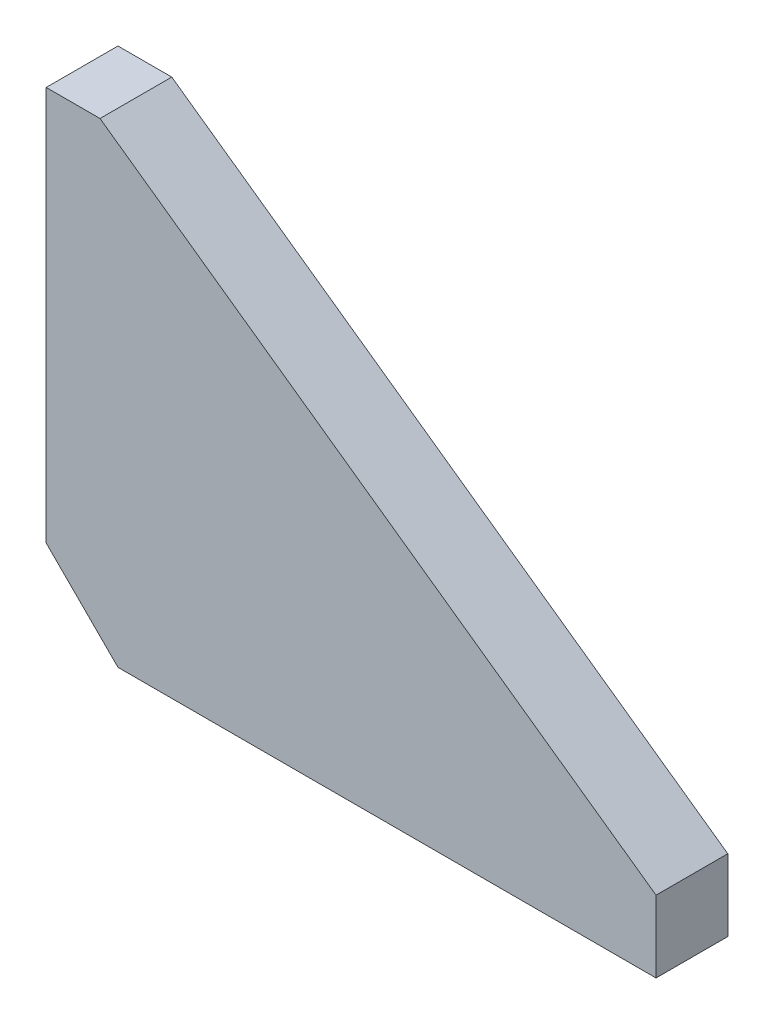
ISO-10303-21;
HEADER;
FILE_DESCRIPTION(('STEP AP214'),'2;1');
FILE_NAME('part.step','',(''),(''),'','','');
FILE_SCHEMA(('AUTOMOTIVE_DESIGN { 1 0 10303 214 1 1 1 1 }'));
ENDSEC;
DATA;
#1=APPLICATION_CONTEXT('core data for automotive mechanical design processes');
#2=APPLICATION_PROTOCOL_DEFINITION('international standard','automotive_design',2000,#1);
#3=PRODUCT_CONTEXT('',#1,'mechanical');
#4=PRODUCT('Part','Part','',(#3));
#5=PRODUCT_RELATED_PRODUCT_CATEGORY('part','',(#4));
#6=PRODUCT_DEFINITION_FORMATION('','',#4);
#7=PRODUCT_DEFINITION_CONTEXT('part definition',#1,'design');
#8=PRODUCT_DEFINITION('design','',#6,#7);
#9=PRODUCT_DEFINITION_SHAPE('','',#8);
#10=(LENGTH_UNIT() NAMED_UNIT(*) SI_UNIT(.MILLI.,.METRE.));
#11=(NAMED_UNIT(*) PLANE_ANGLE_UNIT() SI_UNIT($,.RADIAN.));
#12=(NAMED_UNIT(*) SI_UNIT($,.STERADIAN.) SOLID_ANGLE_UNIT());
#13=UNCERTAINTY_MEASURE_WITH_UNIT(LENGTH_MEASURE(1.E-05),#10,'distance_accuracy_value','');
#14=(GEOMETRIC_REPRESENTATION_CONTEXT(3) GLOBAL_UNCERTAINTY_ASSIGNED_CONTEXT((#13)) GLOBAL_UNIT_ASSIGNED_CONTEXT((#10,
#11,#12)) REPRESENTATION_CONTEXT('',''));
#15=CARTESIAN_POINT('',(0.,0.,0.));
#16=DIRECTION('',(0.,0.,1.));
#17=DIRECTION('',(1.,0.,0.));
#18=AXIS2_PLACEMENT_3D('',#15,#16,#17);
#19=CARTESIAN_POINT('',(70.,0.,4.));
#20=DIRECTION('',(0.,1.,0.));
#21=DIRECTION('',(-1.,0.,0.));
#22=AXIS2_PLACEMENT_3D('',#19,#20,#21);
#23=PLANE('',#22);
#24=DIRECTION('',(1.,0.,0.));
#25=VECTOR('',#24,1.);
#26=CARTESIAN_POINT('',(70.,0.,4.));
#27=LINE('',#26,#25);
#28=CARTESIAN_POINT('',(10.,0.,4.));
#29=VERTEX_POINT('',#28);
#30=CARTESIAN_POINT('',(70.,0.,4.));
#31=VERTEX_POINT('',#30);
#32=EDGE_CURVE('E118',#29,#31,#27,.T.);
#33=ORIENTED_EDGE('',*,*,#32,.F.);
#34=DIRECTION('',(0.,0.,-1.));
#35=VECTOR('',#34,1.);
#36=CARTESIAN_POINT('',(10.,0.,4.));
#37=LINE('',#36,#35);
#38=CARTESIAN_POINT('',(10.,0.,-4.));
#39=VERTEX_POINT('',#38);
#40=EDGE_CURVE('E148',#29,#39,#37,.T.);
#41=ORIENTED_EDGE('',*,*,#40,.T.);
#42=DIRECTION('',(1.,0.,0.));
#43=VECTOR('',#42,1.);
#44=CARTESIAN_POINT('',(70.,0.,-4.));
#45=LINE('',#44,#43);
#46=CARTESIAN_POINT('',(70.,0.,-4.));
#47=VERTEX_POINT('',#46);
#48=EDGE_CURVE('E145',#39,#47,#45,.T.);
#49=ORIENTED_EDGE('',*,*,#48,.T.);
#50=DIRECTION('',(0.,0.,-1.));
#51=VECTOR('',#50,1.);
#52=CARTESIAN_POINT('',(70.,0.,4.));
#53=LINE('',#52,#51);
#54=EDGE_CURVE('E137',#31,#47,#53,.T.);
#55=ORIENTED_EDGE('',*,*,#54,.F.);
#56=EDGE_LOOP('',(#33,#41,#49,#55));
#57=FACE_BOUND('',#56,.T.);
#58=ADVANCED_FACE('F51',(#57),#23,.F.);
#59=CARTESIAN_POINT('',(70.,0.,4.));
#60=DIRECTION('',(-1.,0.,0.));
#61=DIRECTION('',(0.,0.,1.));
#62=AXIS2_PLACEMENT_3D('',#59,#60,#61);
#63=PLANE('',#62);
#64=DIRECTION('',(0.,1.,0.));
#65=VECTOR('',#64,1.);
#66=CARTESIAN_POINT('',(70.,0.,-4.));
#67=LINE('',#66,#65);
#68=CARTESIAN_POINT('',(70.,8.,-4.));
#69=VERTEX_POINT('',#68);
#70=EDGE_CURVE('E217',#47,#69,#67,.T.);
#71=ORIENTED_EDGE('',*,*,#70,.T.);
#72=DIRECTION('',(0.,0.,-1.));
#73=VECTOR('',#72,1.);
#74=CARTESIAN_POINT('',(70.,8.,4.));
#75=LINE('',#74,#73);
#76=CARTESIAN_POINT('',(70.,8.,4.));
#77=VERTEX_POINT('',#76);
#78=EDGE_CURVE('E139',#77,#69,#75,.T.);
#79=ORIENTED_EDGE('',*,*,#78,.F.);
#80=DIRECTION('',(0.,1.,0.));
#81=VECTOR('',#80,1.);
#82=CARTESIAN_POINT('',(70.,0.,4.));
#83=LINE('',#82,#81);
#84=EDGE_CURVE('E122',#31,#77,#83,.T.);
#85=ORIENTED_EDGE('',*,*,#84,.F.);
#86=ORIENTED_EDGE('',*,*,#54,.T.);
#87=EDGE_LOOP('',(#71,#79,#85,#86));
#88=FACE_BOUND('',#87,.T.);
#89=ADVANCED_FACE('F136',(#88),#63,.F.);
#90=CARTESIAN_POINT('',(8.,52.,4.));
#91=DIRECTION('',(-0.578747005941122,-0.815507144735217,0.));
#92=DIRECTION('',(0.815507144735217,-0.578747005941122,0.));
#93=AXIS2_PLACEMENT_3D('',#90,#91,#92);
#94=PLANE('',#93);
#95=DIRECTION('',(-0.815507144735217,0.578747005941122,0.));
#96=VECTOR('',#95,1.);
#97=CARTESIAN_POINT('',(8.,52.,-4.));
#98=LINE('',#97,#96);
#99=CARTESIAN_POINT('',(8.,52.,-4.));
#100=VERTEX_POINT('',#99);
#101=EDGE_CURVE('E222',#69,#100,#98,.T.);
#102=ORIENTED_EDGE('',*,*,#101,.T.);
#103=DIRECTION('',(0.,0.,-1.));
#104=VECTOR('',#103,1.);
#105=CARTESIAN_POINT('',(8.,52.,4.));
#106=LINE('',#105,#104);
#107=CARTESIAN_POINT('',(8.,52.,4.));
#108=VERTEX_POINT('',#107);
#109=EDGE_CURVE('E155',#108,#100,#106,.T.);
#110=ORIENTED_EDGE('',*,*,#109,.F.);
#111=DIRECTION('',(-0.815507144735217,0.578747005941122,0.));
#112=VECTOR('',#111,1.);
#113=CARTESIAN_POINT('',(8.,52.,4.));
#114=LINE('',#113,#112);
#115=EDGE_CURVE('E142',#77,#108,#114,.T.);
#116=ORIENTED_EDGE('',*,*,#115,.F.);
#117=ORIENTED_EDGE('',*,*,#78,.T.);
#118=EDGE_LOOP('',(#102,#110,#116,#117));
#119=FACE_BOUND('',#118,.T.);
#120=ADVANCED_FACE('F232',(#119),#94,.F.);
#121=CARTESIAN_POINT('',(8.,52.,4.));
#122=DIRECTION('',(0.,-1.,0.));
#123=DIRECTION('',(0.,0.,-1.));
#124=AXIS2_PLACEMENT_3D('',#121,#122,#123);
#125=PLANE('',#124);
#126=DIRECTION('',(-1.,0.,0.));
#127=VECTOR('',#126,1.);
#128=CARTESIAN_POINT('',(8.,52.,-4.));
#129=LINE('',#128,#127);
#130=CARTESIAN_POINT('',(2.00000000000001,52.,-4.));
#131=VERTEX_POINT('',#130);
#132=EDGE_CURVE('E132',#100,#131,#129,.T.);
#133=ORIENTED_EDGE('',*,*,#132,.T.);
#134=DIRECTION('',(0.,0.,1.));
#135=VECTOR('',#134,1.);
#136=CARTESIAN_POINT('',(2.00000000000001,52.,4.));
#137=LINE('',#136,#135);
#138=CARTESIAN_POINT('',(2.,52.,4.));
#139=VERTEX_POINT('',#138);
#140=EDGE_CURVE('E61',#131,#139,#137,.T.);
#141=ORIENTED_EDGE('',*,*,#140,.T.);
#142=DIRECTION('',(-1.,0.,0.));
#143=VECTOR('',#142,1.);
#144=CARTESIAN_POINT('',(8.,52.,4.));
#145=LINE('',#144,#143);
#146=EDGE_CURVE('E198',#108,#139,#145,.T.);
#147=ORIENTED_EDGE('',*,*,#146,.F.);
#148=ORIENTED_EDGE('',*,*,#109,.T.);
#149=EDGE_LOOP('',(#133,#141,#147,#148));
#150=FACE_BOUND('',#149,.T.);
#151=ADVANCED_FACE('F196',(#150),#125,.F.);
#152=CARTESIAN_POINT('',(0.,0.,4.));
#153=DIRECTION('',(1.,0.,0.));
#154=DIRECTION('',(0.,0.,-1.));
#155=AXIS2_PLACEMENT_3D('',#152,#153,#154);
#156=PLANE('',#155);
#157=DIRECTION('',(0.,1.,0.));
#158=VECTOR('',#157,1.);
#159=CARTESIAN_POINT('',(0.,0.,1.99999999999999));
#160=LINE('',#159,#158);
#161=CARTESIAN_POINT('',(0.,10.,1.99999999999999));
#162=VERTEX_POINT('',#161);
#163=CARTESIAN_POINT('',(0.,50.,1.99999999999999));
#164=VERTEX_POINT('',#163);
#165=EDGE_CURVE('E168',#162,#164,#160,.T.);
#166=ORIENTED_EDGE('',*,*,#165,.T.);
#167=DIRECTION('',(0.,0.,-1.));
#168=VECTOR('',#167,1.);
#169=CARTESIAN_POINT('',(0.,50.,4.));
#170=LINE('',#169,#168);
#171=CARTESIAN_POINT('',(0.,50.,-2.));
#172=VERTEX_POINT('',#171);
#173=EDGE_CURVE('E187',#164,#172,#170,.T.);
#174=ORIENTED_EDGE('',*,*,#173,.T.);
#175=DIRECTION('',(0.,-1.,0.));
#176=VECTOR('',#175,1.);
#177=CARTESIAN_POINT('',(0.,10.,-2.));
#178=LINE('',#177,#176);
#179=CARTESIAN_POINT('',(0.,10.,-2.));
#180=VERTEX_POINT('',#179);
#181=EDGE_CURVE('E171',#172,#180,#178,.T.);
#182=ORIENTED_EDGE('',*,*,#181,.T.);
#183=DIRECTION('',(0.,0.,1.));
#184=VECTOR('',#183,1.);
#185=CARTESIAN_POINT('',(0.,10.,4.));
#186=LINE('',#185,#184);
#187=EDGE_CURVE('E162',#180,#162,#186,.T.);
#188=ORIENTED_EDGE('',*,*,#187,.T.);
#189=EDGE_LOOP('',(#166,#174,#182,#188));
#190=FACE_BOUND('',#189,.T.);
#191=ADVANCED_FACE('F206',(#190),#156,.F.);
#192=CARTESIAN_POINT('',(0.,0.,4.));
#193=DIRECTION('',(0.,0.,-1.));
#194=DIRECTION('',(-1.,0.,0.));
#195=AXIS2_PLACEMENT_3D('',#192,#193,#194);
#196=PLANE('',#195);
#197=ORIENTED_EDGE('',*,*,#146,.T.);
#198=DIRECTION('',(0.,-1.,0.));
#199=VECTOR('',#198,1.);
#200=CARTESIAN_POINT('',(2.,0.,4.));
#201=LINE('',#200,#199);
#202=CARTESIAN_POINT('',(2.,8.00000000000003,4.));
#203=VERTEX_POINT('',#202);
#204=EDGE_CURVE('E184',#139,#203,#201,.T.);
#205=ORIENTED_EDGE('',*,*,#204,.T.);
#206=DIRECTION('',(-0.707106781186546,0.707106781186549,0.));
#207=VECTOR('',#206,1.);
#208=CARTESIAN_POINT('',(10.,0.,4.));
#209=LINE('',#208,#207);
#210=EDGE_CURVE('E126',#203,#29,#209,.F.);
#211=ORIENTED_EDGE('',*,*,#210,.T.);
#212=ORIENTED_EDGE('',*,*,#32,.T.);
#213=ORIENTED_EDGE('',*,*,#84,.T.);
#214=ORIENTED_EDGE('',*,*,#115,.T.);
#215=EDGE_LOOP('',(#197,#205,#211,#212,#213,#214));
#216=FACE_BOUND('',#215,.T.);
#217=ADVANCED_FACE('F121',(#216),#196,.F.);
#218=CARTESIAN_POINT('',(0.,0.,-4.));
#219=DIRECTION('',(0.,0.,-1.));
#220=DIRECTION('',(-1.,0.,0.));
#221=AXIS2_PLACEMENT_3D('',#218,#219,#220);
#222=PLANE('',#221);
#223=DIRECTION('',(0.707106781186546,-0.707106781186549,0.));
#224=VECTOR('',#223,1.);
#225=CARTESIAN_POINT('',(5.00000000000002,5.,-4.));
#226=LINE('',#225,#224);
#227=CARTESIAN_POINT('',(2.00000000000001,8.00000000000002,-4.));
#228=VERTEX_POINT('',#227);
#229=EDGE_CURVE('E153',#39,#228,#226,.F.);
#230=ORIENTED_EDGE('',*,*,#229,.T.);
#231=DIRECTION('',(0.,1.,0.));
#232=VECTOR('',#231,1.);
#233=CARTESIAN_POINT('',(2.00000000000001,52.,-4.));
#234=LINE('',#233,#232);
#235=EDGE_CURVE('E180',#228,#131,#234,.T.);
#236=ORIENTED_EDGE('',*,*,#235,.T.);
#237=ORIENTED_EDGE('',*,*,#132,.F.);
#238=ORIENTED_EDGE('',*,*,#101,.F.);
#239=ORIENTED_EDGE('',*,*,#70,.F.);
#240=ORIENTED_EDGE('',*,*,#48,.F.);
#241=EDGE_LOOP('',(#230,#236,#237,#238,#239,#240));
#242=FACE_BOUND('',#241,.T.);
#243=ADVANCED_FACE('F215',(#242),#222,.T.);
#244=CARTESIAN_POINT('',(10.,0.,4.));
#245=DIRECTION('',(0.707106781186549,0.707106781186546,0.));
#246=DIRECTION('',(0.,0.,-1.));
#247=AXIS2_PLACEMENT_3D('',#244,#245,#246);
#248=PLANE('',#247);
#249=ORIENTED_EDGE('',*,*,#187,.F.);
#250=DIRECTION('',(-0.577350269189626,0.577350269189628,0.577350269189624));
#251=VECTOR('',#250,1.);
#252=CARTESIAN_POINT('',(4.6666666666667,5.33333333333332,-6.66666666666668));
#253=LINE('',#252,#251);
#254=EDGE_CURVE('E177',#180,#228,#253,.F.);
#255=ORIENTED_EDGE('',*,*,#254,.T.);
#256=ORIENTED_EDGE('',*,*,#229,.F.);
#257=ORIENTED_EDGE('',*,*,#40,.F.);
#258=ORIENTED_EDGE('',*,*,#210,.F.);
#259=DIRECTION('',(-0.577350269189625,0.577350269189627,-0.577350269189627));
#260=VECTOR('',#259,1.);
#261=CARTESIAN_POINT('',(7.33333333333333,2.66666666666668,9.33333333333335));
#262=LINE('',#261,#260);
#263=EDGE_CURVE('E174',#203,#162,#262,.T.);
#264=ORIENTED_EDGE('',*,*,#263,.T.);
#265=EDGE_LOOP('',(#249,#255,#256,#257,#258,#264));
#266=FACE_BOUND('',#265,.T.);
#267=ADVANCED_FACE('F213',(#266),#248,.F.);
#268=CARTESIAN_POINT('',(0.,0.,-2.));
#269=DIRECTION('',(-0.707106781186546,0.,-0.707106781186549));
#270=DIRECTION('',(0.,1.,0.));
#271=AXIS2_PLACEMENT_3D('',#268,#269,#270);
#272=PLANE('',#271);
#273=ORIENTED_EDGE('',*,*,#181,.F.);
#274=DIRECTION('',(-0.577350269189627,-0.577350269189625,0.577350269189625));
#275=VECTOR('',#274,1.);
#276=CARTESIAN_POINT('',(-16.6666666666667,33.3333333333334,14.6666666666666));
#277=LINE('',#276,#275);
#278=EDGE_CURVE('E74',#172,#131,#277,.F.);
#279=ORIENTED_EDGE('',*,*,#278,.T.);
#280=ORIENTED_EDGE('',*,*,#235,.F.);
#281=ORIENTED_EDGE('',*,*,#254,.F.);
#282=EDGE_LOOP('',(#273,#279,#280,#281));
#283=FACE_BOUND('',#282,.T.);
#284=ADVANCED_FACE('F209',(#283),#272,.T.);
#285=CARTESIAN_POINT('',(2.,0.,4.));
#286=DIRECTION('',(0.707106781186549,0.,-0.707106781186546));
#287=DIRECTION('',(0.,-1.,0.));
#288=AXIS2_PLACEMENT_3D('',#285,#286,#287);
#289=PLANE('',#288);
#290=ORIENTED_EDGE('',*,*,#204,.F.);
#291=DIRECTION('',(-0.577350269189626,-0.577350269189624,-0.577350269189628));
#292=VECTOR('',#291,1.);
#293=CARTESIAN_POINT('',(-15.3333333333333,34.6666666666668,-13.3333333333333));
#294=LINE('',#293,#292);
#295=EDGE_CURVE('E11',#139,#164,#294,.T.);
#296=ORIENTED_EDGE('',*,*,#295,.T.);
#297=ORIENTED_EDGE('',*,*,#165,.F.);
#298=ORIENTED_EDGE('',*,*,#263,.F.);
#299=EDGE_LOOP('',(#290,#296,#297,#298));
#300=FACE_BOUND('',#299,.T.);
#301=ADVANCED_FACE('F203',(#300),#289,.F.);
#302=CARTESIAN_POINT('',(0.,50.,4.));
#303=DIRECTION('',(0.707106781186546,-0.707106781186549,0.));
#304=DIRECTION('',(0.,0.,-1.));
#305=AXIS2_PLACEMENT_3D('',#302,#303,#304);
#306=PLANE('',#305);
#307=ORIENTED_EDGE('',*,*,#295,.F.);
#308=ORIENTED_EDGE('',*,*,#140,.F.);
#309=ORIENTED_EDGE('',*,*,#278,.F.);
#310=ORIENTED_EDGE('',*,*,#173,.F.);
#311=EDGE_LOOP('',(#307,#308,#309,#310));
#312=FACE_BOUND('',#311,.T.);
#313=ADVANCED_FACE('F54',(#312),#306,.F.);
#314=CLOSED_SHELL('',(#58,#89,#120,#151,#191,#217,#243,#267,#284,#301,#313));
#315=MANIFOLD_SOLID_BREP('B2',#314);
#316=ADVANCED_BREP_SHAPE_REPRESENTATION('',(#18,#315),#14);
#317=SHAPE_DEFINITION_REPRESENTATION(#9,#316);
ENDSEC;
END-ISO-10303-21;
